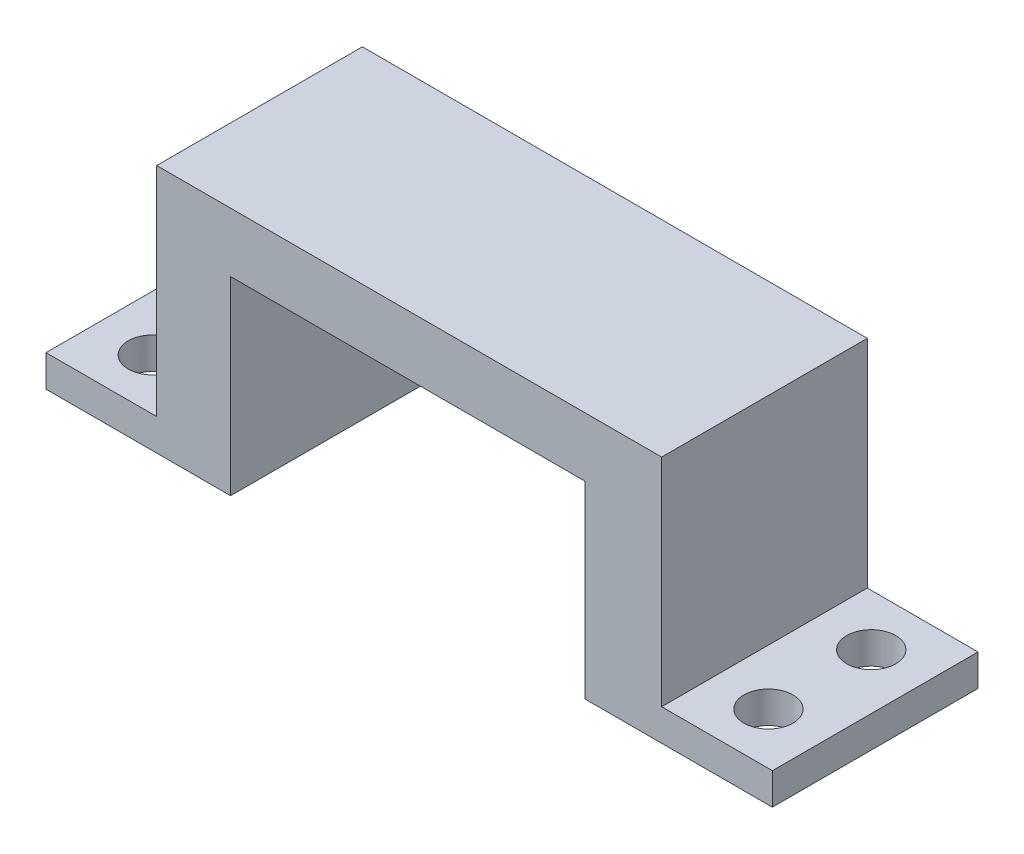
ISO-10303-21;
HEADER;
FILE_DESCRIPTION(('STEP AP214'),'2;1');
FILE_NAME('part.step','',(''),(''),'','','');
FILE_SCHEMA(('AUTOMOTIVE_DESIGN { 1 0 10303 214 1 1 1 1 }'));
ENDSEC;
DATA;
#1=APPLICATION_CONTEXT('core data for automotive mechanical design processes');
#2=APPLICATION_PROTOCOL_DEFINITION('international standard','automotive_design',2000,#1);
#3=PRODUCT_CONTEXT('',#1,'mechanical');
#4=PRODUCT('Part','Part','',(#3));
#5=PRODUCT_RELATED_PRODUCT_CATEGORY('part','',(#4));
#6=PRODUCT_DEFINITION_FORMATION('','',#4);
#7=PRODUCT_DEFINITION_CONTEXT('part definition',#1,'design');
#8=PRODUCT_DEFINITION('design','',#6,#7);
#9=PRODUCT_DEFINITION_SHAPE('','',#8);
#10=(LENGTH_UNIT() NAMED_UNIT(*) SI_UNIT(.MILLI.,.METRE.));
#11=(NAMED_UNIT(*) PLANE_ANGLE_UNIT() SI_UNIT($,.RADIAN.));
#12=(NAMED_UNIT(*) SI_UNIT($,.STERADIAN.) SOLID_ANGLE_UNIT());
#13=UNCERTAINTY_MEASURE_WITH_UNIT(LENGTH_MEASURE(1.E-05),#10,'distance_accuracy_value','');
#14=(GEOMETRIC_REPRESENTATION_CONTEXT(3) GLOBAL_UNCERTAINTY_ASSIGNED_CONTEXT((#13)) GLOBAL_UNIT_ASSIGNED_CONTEXT((#10,
#11,#12)) REPRESENTATION_CONTEXT('',''));
#15=CARTESIAN_POINT('',(0.,0.,0.));
#16=DIRECTION('',(0.,0.,1.));
#17=DIRECTION('',(1.,0.,0.));
#18=AXIS2_PLACEMENT_3D('',#15,#16,#17);
#19=CARTESIAN_POINT('',(0.,4.99999999999997,13.));
#20=DIRECTION('',(0.,1.,0.));
#21=DIRECTION('',(-1.,0.,0.));
#22=AXIS2_PLACEMENT_3D('',#19,#20,#21);
#23=PLANE('',#22);
#24=CARTESIAN_POINT('',(-52.5285351509152,5.,9.75));
#25=DIRECTION('',(0.,1.,0.));
#26=DIRECTION('',(0.,0.,-1.));
#27=AXIS2_PLACEMENT_3D('',#24,#25,#26);
#28=CIRCLE('',#27,1.55);
#29=CARTESIAN_POINT('',(-52.5285351509152,5.,8.2));
#30=VERTEX_POINT('',#29);
#31=EDGE_CURVE('E228',#30,#30,#28,.T.);
#32=ORIENTED_EDGE('',*,*,#31,.T.);
#33=EDGE_LOOP('',(#32));
#34=FACE_BOUND('',#33,.T.);
#35=CARTESIAN_POINT('',(-52.5285351509152,5.,3.25));
#36=DIRECTION('',(0.,1.,0.));
#37=DIRECTION('',(0.,0.,1.));
#38=AXIS2_PLACEMENT_3D('',#35,#36,#37);
#39=CIRCLE('',#38,1.54999999999999);
#40=CARTESIAN_POINT('',(-52.5285351509152,5.,4.8));
#41=VERTEX_POINT('',#40);
#42=EDGE_CURVE('E214',#41,#41,#39,.T.);
#43=ORIENTED_EDGE('',*,*,#42,.T.);
#44=EDGE_LOOP('',(#43));
#45=FACE_BOUND('',#44,.T.);
#46=DIRECTION('',(1.,0.,0.));
#47=VECTOR('',#46,1.);
#48=CARTESIAN_POINT('',(0.,4.99999999999997,0.));
#49=LINE('',#48,#47);
#50=CARTESIAN_POINT('',(-56.0285351509152,5.,0.));
#51=VERTEX_POINT('',#50);
#52=CARTESIAN_POINT('',(-44.3575351509152,5.,0.));
#53=VERTEX_POINT('',#52);
#54=EDGE_CURVE('E160',#51,#53,#49,.T.);
#55=ORIENTED_EDGE('',*,*,#54,.T.);
#56=DIRECTION('',(0.,0.,-1.));
#57=VECTOR('',#56,1.);
#58=CARTESIAN_POINT('',(-44.3575351509152,5.,13.));
#59=LINE('',#58,#57);
#60=CARTESIAN_POINT('',(-44.3575351509152,5.,13.));
#61=VERTEX_POINT('',#60);
#62=EDGE_CURVE('E11',#61,#53,#59,.T.);
#63=ORIENTED_EDGE('',*,*,#62,.F.);
#64=DIRECTION('',(1.,0.,0.));
#65=VECTOR('',#64,1.);
#66=CARTESIAN_POINT('',(0.,4.99999999999997,13.));
#67=LINE('',#66,#65);
#68=CARTESIAN_POINT('',(-56.0285351509152,5.,13.));
#69=VERTEX_POINT('',#68);
#70=EDGE_CURVE('E189',#69,#61,#67,.T.);
#71=ORIENTED_EDGE('',*,*,#70,.F.);
#72=DIRECTION('',(0.,0.,-1.));
#73=VECTOR('',#72,1.);
#74=CARTESIAN_POINT('',(-56.0285351509152,5.,13.));
#75=LINE('',#74,#73);
#76=EDGE_CURVE('E53',#69,#51,#75,.T.);
#77=ORIENTED_EDGE('',*,*,#76,.T.);
#78=EDGE_LOOP('',(#55,#63,#71,#77));
#79=FACE_BOUND('',#78,.T.);
#80=ADVANCED_FACE('F35',(#34,#45,#79),#23,.F.);
#81=CARTESIAN_POINT('',(-44.3575351509152,0.,13.));
#82=DIRECTION('',(-1.,0.,0.));
#83=DIRECTION('',(0.,0.,1.));
#84=AXIS2_PLACEMENT_3D('',#81,#82,#83);
#85=PLANE('',#84);
#86=DIRECTION('',(0.,1.,0.));
#87=VECTOR('',#86,1.);
#88=CARTESIAN_POINT('',(-44.3575351509152,0.,0.));
#89=LINE('',#88,#87);
#90=CARTESIAN_POINT('',(-44.3575351509152,17.,0.));
#91=VERTEX_POINT('',#90);
#92=EDGE_CURVE('E162',#53,#91,#89,.T.);
#93=ORIENTED_EDGE('',*,*,#92,.T.);
#94=DIRECTION('',(0.,0.,-1.));
#95=VECTOR('',#94,1.);
#96=CARTESIAN_POINT('',(-44.3575351509152,17.,13.));
#97=LINE('',#96,#95);
#98=CARTESIAN_POINT('',(-44.3575351509152,17.,13.));
#99=VERTEX_POINT('',#98);
#100=EDGE_CURVE('E44',#99,#91,#97,.T.);
#101=ORIENTED_EDGE('',*,*,#100,.F.);
#102=DIRECTION('',(0.,1.,0.));
#103=VECTOR('',#102,1.);
#104=CARTESIAN_POINT('',(-44.3575351509152,0.,13.));
#105=LINE('',#104,#103);
#106=EDGE_CURVE('E104',#61,#99,#105,.T.);
#107=ORIENTED_EDGE('',*,*,#106,.F.);
#108=ORIENTED_EDGE('',*,*,#62,.T.);
#109=EDGE_LOOP('',(#93,#101,#107,#108));
#110=FACE_BOUND('',#109,.T.);
#111=ADVANCED_FACE('F267',(#110),#85,.F.);
#112=CARTESIAN_POINT('',(0.,17.,13.));
#113=DIRECTION('',(0.,1.,0.));
#114=DIRECTION('',(0.,0.,1.));
#115=AXIS2_PLACEMENT_3D('',#112,#113,#114);
#116=PLANE('',#115);
#117=DIRECTION('',(1.,0.,0.));
#118=VECTOR('',#117,1.);
#119=CARTESIAN_POINT('',(0.,17.,0.));
#120=LINE('',#119,#118);
#121=CARTESIAN_POINT('',(-21.9575351509152,17.,0.));
#122=VERTEX_POINT('',#121);
#123=EDGE_CURVE('E165',#91,#122,#120,.T.);
#124=ORIENTED_EDGE('',*,*,#123,.T.);
#125=DIRECTION('',(0.,0.,-1.));
#126=VECTOR('',#125,1.);
#127=CARTESIAN_POINT('',(-21.9575351509152,17.,13.));
#128=LINE('',#127,#126);
#129=CARTESIAN_POINT('',(-21.9575351509152,17.,13.));
#130=VERTEX_POINT('',#129);
#131=EDGE_CURVE('E205',#130,#122,#128,.T.);
#132=ORIENTED_EDGE('',*,*,#131,.F.);
#133=DIRECTION('',(1.,0.,0.));
#134=VECTOR('',#133,1.);
#135=CARTESIAN_POINT('',(0.,17.,13.));
#136=LINE('',#135,#134);
#137=EDGE_CURVE('E234',#99,#130,#136,.T.);
#138=ORIENTED_EDGE('',*,*,#137,.F.);
#139=ORIENTED_EDGE('',*,*,#100,.T.);
#140=EDGE_LOOP('',(#124,#132,#138,#139));
#141=FACE_BOUND('',#140,.T.);
#142=ADVANCED_FACE('F272',(#141),#116,.F.);
#143=CARTESIAN_POINT('',(-21.9575351509152,0.,13.));
#144=DIRECTION('',(1.,0.,0.));
#145=DIRECTION('',(0.,0.,-1.));
#146=AXIS2_PLACEMENT_3D('',#143,#144,#145);
#147=PLANE('',#146);
#148=DIRECTION('',(0.,-1.,0.));
#149=VECTOR('',#148,1.);
#150=CARTESIAN_POINT('',(-21.9575351509152,0.,0.));
#151=LINE('',#150,#149);
#152=CARTESIAN_POINT('',(-21.9575351509152,5.07439487757862,0.));
#153=VERTEX_POINT('',#152);
#154=EDGE_CURVE('E167',#122,#153,#151,.T.);
#155=ORIENTED_EDGE('',*,*,#154,.T.);
#156=DIRECTION('',(0.,0.,-1.));
#157=VECTOR('',#156,1.);
#158=CARTESIAN_POINT('',(-21.9575351509152,5.07439487757862,13.));
#159=LINE('',#158,#157);
#160=CARTESIAN_POINT('',(-21.9575351509152,5.07439487757862,13.));
#161=VERTEX_POINT('',#160);
#162=EDGE_CURVE('E202',#161,#153,#159,.T.);
#163=ORIENTED_EDGE('',*,*,#162,.F.);
#164=DIRECTION('',(0.,-1.,0.));
#165=VECTOR('',#164,1.);
#166=CARTESIAN_POINT('',(-21.9575351509152,0.,13.));
#167=LINE('',#166,#165);
#168=EDGE_CURVE('E236',#130,#161,#167,.T.);
#169=ORIENTED_EDGE('',*,*,#168,.F.);
#170=ORIENTED_EDGE('',*,*,#131,.T.);
#171=EDGE_LOOP('',(#155,#163,#169,#170));
#172=FACE_BOUND('',#171,.T.);
#173=ADVANCED_FACE('F288',(#172),#147,.F.);
#174=CARTESIAN_POINT('',(0.,5.07439487757862,13.));
#175=DIRECTION('',(0.,1.,0.));
#176=DIRECTION('',(0.,0.,1.));
#177=AXIS2_PLACEMENT_3D('',#174,#175,#176);
#178=PLANE('',#177);
#179=CARTESIAN_POINT('',(-13.6069300284939,5.07439487757862,3.25));
#180=DIRECTION('',(0.,1.,0.));
#181=DIRECTION('',(0.,0.,1.));
#182=AXIS2_PLACEMENT_3D('',#179,#180,#181);
#183=CIRCLE('',#182,1.55);
#184=CARTESIAN_POINT('',(-13.6069300284939,5.07439487757862,4.8));
#185=VERTEX_POINT('',#184);
#186=EDGE_CURVE('E163',#185,#185,#183,.T.);
#187=ORIENTED_EDGE('',*,*,#186,.T.);
#188=EDGE_LOOP('',(#187));
#189=FACE_BOUND('',#188,.T.);
#190=CARTESIAN_POINT('',(-13.6069300284939,5.07439487757862,9.75));
#191=DIRECTION('',(0.,1.,0.));
#192=DIRECTION('',(0.,0.,1.));
#193=AXIS2_PLACEMENT_3D('',#190,#191,#192);
#194=CIRCLE('',#193,1.55);
#195=CARTESIAN_POINT('',(-13.6069300284939,5.07439487757862,11.3));
#196=VERTEX_POINT('',#195);
#197=EDGE_CURVE('E218',#196,#196,#194,.T.);
#198=ORIENTED_EDGE('',*,*,#197,.T.);
#199=EDGE_LOOP('',(#198));
#200=FACE_BOUND('',#199,.T.);
#201=DIRECTION('',(1.,0.,0.));
#202=VECTOR('',#201,1.);
#203=CARTESIAN_POINT('',(0.,5.07439487757862,0.));
#204=LINE('',#203,#202);
#205=CARTESIAN_POINT('',(-10.1069300284939,5.07439487757862,0.));
#206=VERTEX_POINT('',#205);
#207=EDGE_CURVE('E169',#153,#206,#204,.T.);
#208=ORIENTED_EDGE('',*,*,#207,.T.);
#209=DIRECTION('',(0.,0.,-1.));
#210=VECTOR('',#209,1.);
#211=CARTESIAN_POINT('',(-10.1069300284939,5.07439487757862,13.));
#212=LINE('',#211,#210);
#213=CARTESIAN_POINT('',(-10.1069300284939,5.07439487757862,13.));
#214=VERTEX_POINT('',#213);
#215=EDGE_CURVE('E199',#214,#206,#212,.T.);
#216=ORIENTED_EDGE('',*,*,#215,.F.);
#217=DIRECTION('',(1.,0.,0.));
#218=VECTOR('',#217,1.);
#219=CARTESIAN_POINT('',(0.,5.07439487757862,13.));
#220=LINE('',#219,#218);
#221=EDGE_CURVE('E238',#161,#214,#220,.T.);
#222=ORIENTED_EDGE('',*,*,#221,.F.);
#223=ORIENTED_EDGE('',*,*,#162,.T.);
#224=EDGE_LOOP('',(#208,#216,#222,#223));
#225=FACE_BOUND('',#224,.T.);
#226=ADVANCED_FACE('F292',(#189,#200,#225),#178,.F.);
#227=CARTESIAN_POINT('',(-10.1069300284939,0.,13.));
#228=DIRECTION('',(-1.,0.,0.));
#229=DIRECTION('',(0.,0.,1.));
#230=AXIS2_PLACEMENT_3D('',#227,#228,#229);
#231=PLANE('',#230);
#232=DIRECTION('',(0.,1.,0.));
#233=VECTOR('',#232,1.);
#234=CARTESIAN_POINT('',(-10.1069300284939,0.,0.));
#235=LINE('',#234,#233);
#236=CARTESIAN_POINT('',(-10.1069300284939,7.07439487757862,0.));
#237=VERTEX_POINT('',#236);
#238=EDGE_CURVE('E171',#206,#237,#235,.T.);
#239=ORIENTED_EDGE('',*,*,#238,.T.);
#240=DIRECTION('',(0.,0.,-1.));
#241=VECTOR('',#240,1.);
#242=CARTESIAN_POINT('',(-10.1069300284939,7.07439487757862,13.));
#243=LINE('',#242,#241);
#244=CARTESIAN_POINT('',(-10.1069300284939,7.07439487757862,13.));
#245=VERTEX_POINT('',#244);
#246=EDGE_CURVE('E197',#245,#237,#243,.T.);
#247=ORIENTED_EDGE('',*,*,#246,.F.);
#248=DIRECTION('',(0.,1.,0.));
#249=VECTOR('',#248,1.);
#250=CARTESIAN_POINT('',(-10.1069300284939,0.,13.));
#251=LINE('',#250,#249);
#252=EDGE_CURVE('E240',#214,#245,#251,.T.);
#253=ORIENTED_EDGE('',*,*,#252,.F.);
#254=ORIENTED_EDGE('',*,*,#215,.T.);
#255=EDGE_LOOP('',(#239,#247,#253,#254));
#256=FACE_BOUND('',#255,.T.);
#257=ADVANCED_FACE('F297',(#256),#231,.F.);
#258=CARTESIAN_POINT('',(0.,7.07439487757862,13.));
#259=DIRECTION('',(0.,1.,0.));
#260=DIRECTION('',(0.,0.,1.));
#261=AXIS2_PLACEMENT_3D('',#258,#259,#260);
#262=PLANE('',#261);
#263=CARTESIAN_POINT('',(-13.6069300284939,7.07439487757862,3.25));
#264=DIRECTION('',(0.,1.,0.));
#265=DIRECTION('',(0.,0.,1.));
#266=AXIS2_PLACEMENT_3D('',#263,#264,#265);
#267=CIRCLE('',#266,1.55);
#268=CARTESIAN_POINT('',(-13.6069300284939,7.07439487757862,4.8));
#269=VERTEX_POINT('',#268);
#270=EDGE_CURVE('E38',#269,#269,#267,.T.);
#271=ORIENTED_EDGE('',*,*,#270,.F.);
#272=EDGE_LOOP('',(#271));
#273=FACE_BOUND('',#272,.T.);
#274=CARTESIAN_POINT('',(-13.6069300284939,7.07439487757862,9.75));
#275=DIRECTION('',(0.,1.,0.));
#276=DIRECTION('',(0.,0.,1.));
#277=AXIS2_PLACEMENT_3D('',#274,#275,#276);
#278=CIRCLE('',#277,1.55);
#279=CARTESIAN_POINT('',(-13.6069300284939,7.07439487757862,11.3));
#280=VERTEX_POINT('',#279);
#281=EDGE_CURVE('E216',#280,#280,#278,.T.);
#282=ORIENTED_EDGE('',*,*,#281,.F.);
#283=EDGE_LOOP('',(#282));
#284=FACE_BOUND('',#283,.T.);
#285=DIRECTION('',(1.,0.,0.));
#286=VECTOR('',#285,1.);
#287=CARTESIAN_POINT('',(0.,7.07439487757862,0.));
#288=LINE('',#287,#286);
#289=CARTESIAN_POINT('',(-17.1069300284939,7.07439487757862,0.));
#290=VERTEX_POINT('',#289);
#291=EDGE_CURVE('E174',#290,#237,#288,.T.);
#292=ORIENTED_EDGE('',*,*,#291,.F.);
#293=DIRECTION('',(0.,0.,-1.));
#294=VECTOR('',#293,1.);
#295=CARTESIAN_POINT('',(-17.1069300284939,7.07439487757862,13.));
#296=LINE('',#295,#294);
#297=CARTESIAN_POINT('',(-17.1069300284939,7.07439487757862,13.));
#298=VERTEX_POINT('',#297);
#299=EDGE_CURVE('E195',#298,#290,#296,.T.);
#300=ORIENTED_EDGE('',*,*,#299,.F.);
#301=DIRECTION('',(1.,0.,0.));
#302=VECTOR('',#301,1.);
#303=CARTESIAN_POINT('',(0.,7.07439487757862,13.));
#304=LINE('',#303,#302);
#305=EDGE_CURVE('E242',#298,#245,#304,.T.);
#306=ORIENTED_EDGE('',*,*,#305,.T.);
#307=ORIENTED_EDGE('',*,*,#246,.T.);
#308=EDGE_LOOP('',(#292,#300,#306,#307));
#309=FACE_BOUND('',#308,.T.);
#310=ADVANCED_FACE('F299',(#273,#284,#309),#262,.T.);
#311=CARTESIAN_POINT('',(-17.1069300284939,0.,13.));
#312=DIRECTION('',(1.,0.,0.));
#313=DIRECTION('',(0.,0.,-1.));
#314=AXIS2_PLACEMENT_3D('',#311,#312,#313);
#315=PLANE('',#314);
#316=DIRECTION('',(0.,-1.,0.));
#317=VECTOR('',#316,1.);
#318=CARTESIAN_POINT('',(-17.1069300284939,0.,0.));
#319=LINE('',#318,#317);
#320=CARTESIAN_POINT('',(-17.1069300284939,20.746,0.));
#321=VERTEX_POINT('',#320);
#322=EDGE_CURVE('E177',#321,#290,#319,.T.);
#323=ORIENTED_EDGE('',*,*,#322,.F.);
#324=DIRECTION('',(0.,0.,-1.));
#325=VECTOR('',#324,1.);
#326=CARTESIAN_POINT('',(-17.1069300284939,20.746,13.));
#327=LINE('',#326,#325);
#328=CARTESIAN_POINT('',(-17.1069300284939,20.746,13.));
#329=VERTEX_POINT('',#328);
#330=EDGE_CURVE('E193',#329,#321,#327,.T.);
#331=ORIENTED_EDGE('',*,*,#330,.F.);
#332=DIRECTION('',(0.,-1.,0.));
#333=VECTOR('',#332,1.);
#334=CARTESIAN_POINT('',(-17.1069300284939,0.,13.));
#335=LINE('',#334,#333);
#336=EDGE_CURVE('E155',#329,#298,#335,.T.);
#337=ORIENTED_EDGE('',*,*,#336,.T.);
#338=ORIENTED_EDGE('',*,*,#299,.T.);
#339=EDGE_LOOP('',(#323,#331,#337,#338));
#340=FACE_BOUND('',#339,.T.);
#341=ADVANCED_FACE('F247',(#340),#315,.T.);
#342=CARTESIAN_POINT('',(0.,20.746,13.));
#343=DIRECTION('',(0.,1.,0.));
#344=DIRECTION('',(0.,0.,1.));
#345=AXIS2_PLACEMENT_3D('',#342,#343,#344);
#346=PLANE('',#345);
#347=DIRECTION('',(1.,0.,0.));
#348=VECTOR('',#347,1.);
#349=CARTESIAN_POINT('',(0.,20.746,0.));
#350=LINE('',#349,#348);
#351=CARTESIAN_POINT('',(-49.0285351509152,20.746,0.));
#352=VERTEX_POINT('',#351);
#353=EDGE_CURVE('E180',#352,#321,#350,.T.);
#354=ORIENTED_EDGE('',*,*,#353,.F.);
#355=DIRECTION('',(0.,0.,-1.));
#356=VECTOR('',#355,1.);
#357=CARTESIAN_POINT('',(-49.0285351509152,20.746,13.));
#358=LINE('',#357,#356);
#359=CARTESIAN_POINT('',(-49.0285351509152,20.746,13.));
#360=VERTEX_POINT('',#359);
#361=EDGE_CURVE('E141',#360,#352,#358,.T.);
#362=ORIENTED_EDGE('',*,*,#361,.F.);
#363=DIRECTION('',(1.,0.,0.));
#364=VECTOR('',#363,1.);
#365=CARTESIAN_POINT('',(0.,20.746,13.));
#366=LINE('',#365,#364);
#367=EDGE_CURVE('E153',#360,#329,#366,.T.);
#368=ORIENTED_EDGE('',*,*,#367,.T.);
#369=ORIENTED_EDGE('',*,*,#330,.T.);
#370=EDGE_LOOP('',(#354,#362,#368,#369));
#371=FACE_BOUND('',#370,.T.);
#372=ADVANCED_FACE('F252',(#371),#346,.T.);
#373=CARTESIAN_POINT('',(-49.0285351509152,0.,13.));
#374=DIRECTION('',(-1.,0.,0.));
#375=DIRECTION('',(0.,0.,1.));
#376=AXIS2_PLACEMENT_3D('',#373,#374,#375);
#377=PLANE('',#376);
#378=DIRECTION('',(0.,1.,0.));
#379=VECTOR('',#378,1.);
#380=CARTESIAN_POINT('',(-49.0285351509152,0.,0.));
#381=LINE('',#380,#379);
#382=CARTESIAN_POINT('',(-49.0285351509152,7.,0.));
#383=VERTEX_POINT('',#382);
#384=EDGE_CURVE('E138',#383,#352,#381,.T.);
#385=ORIENTED_EDGE('',*,*,#384,.F.);
#386=DIRECTION('',(0.,0.,-1.));
#387=VECTOR('',#386,1.);
#388=CARTESIAN_POINT('',(-49.0285351509152,7.,13.));
#389=LINE('',#388,#387);
#390=CARTESIAN_POINT('',(-49.0285351509152,7.,13.));
#391=VERTEX_POINT('',#390);
#392=EDGE_CURVE('E132',#391,#383,#389,.T.);
#393=ORIENTED_EDGE('',*,*,#392,.F.);
#394=DIRECTION('',(0.,1.,0.));
#395=VECTOR('',#394,1.);
#396=CARTESIAN_POINT('',(-49.0285351509152,0.,13.));
#397=LINE('',#396,#395);
#398=EDGE_CURVE('E136',#391,#360,#397,.T.);
#399=ORIENTED_EDGE('',*,*,#398,.T.);
#400=ORIENTED_EDGE('',*,*,#361,.T.);
#401=EDGE_LOOP('',(#385,#393,#399,#400));
#402=FACE_BOUND('',#401,.T.);
#403=ADVANCED_FACE('F134',(#402),#377,.T.);
#404=CARTESIAN_POINT('',(0.,7.00000000000001,13.));
#405=DIRECTION('',(0.,-1.,0.));
#406=DIRECTION('',(1.,0.,0.));
#407=AXIS2_PLACEMENT_3D('',#404,#405,#406);
#408=PLANE('',#407);
#409=CARTESIAN_POINT('',(-52.5285351509152,7.,9.75));
#410=DIRECTION('',(0.,-1.,0.));
#411=DIRECTION('',(1.,0.,0.));
#412=AXIS2_PLACEMENT_3D('',#409,#410,#411);
#413=CIRCLE('',#412,1.55);
#414=CARTESIAN_POINT('',(-50.9785351509152,7.,9.75));
#415=VERTEX_POINT('',#414);
#416=EDGE_CURVE('E213',#415,#415,#413,.T.);
#417=ORIENTED_EDGE('',*,*,#416,.T.);
#418=EDGE_LOOP('',(#417));
#419=FACE_BOUND('',#418,.T.);
#420=CARTESIAN_POINT('',(-52.5285351509152,7.,3.25));
#421=DIRECTION('',(0.,-1.,0.));
#422=DIRECTION('',(1.,0.,0.));
#423=AXIS2_PLACEMENT_3D('',#420,#421,#422);
#424=CIRCLE('',#423,1.54999999999999);
#425=CARTESIAN_POINT('',(-50.9785351509152,7.,3.25));
#426=VERTEX_POINT('',#425);
#427=EDGE_CURVE('E210',#426,#426,#424,.T.);
#428=ORIENTED_EDGE('',*,*,#427,.T.);
#429=EDGE_LOOP('',(#428));
#430=FACE_BOUND('',#429,.T.);
#431=DIRECTION('',(-1.,0.,0.));
#432=VECTOR('',#431,1.);
#433=CARTESIAN_POINT('',(0.,7.00000000000001,0.));
#434=LINE('',#433,#432);
#435=CARTESIAN_POINT('',(-56.0285351509152,7.,0.));
#436=VERTEX_POINT('',#435);
#437=EDGE_CURVE('E184',#383,#436,#434,.T.);
#438=ORIENTED_EDGE('',*,*,#437,.T.);
#439=DIRECTION('',(0.,0.,-1.));
#440=VECTOR('',#439,1.);
#441=CARTESIAN_POINT('',(-56.0285351509152,7.,13.));
#442=LINE('',#441,#440);
#443=CARTESIAN_POINT('',(-56.0285351509152,7.,13.));
#444=VERTEX_POINT('',#443);
#445=EDGE_CURVE('E92',#444,#436,#442,.T.);
#446=ORIENTED_EDGE('',*,*,#445,.F.);
#447=DIRECTION('',(-1.,0.,0.));
#448=VECTOR('',#447,1.);
#449=CARTESIAN_POINT('',(0.,7.00000000000001,13.));
#450=LINE('',#449,#448);
#451=EDGE_CURVE('E143',#391,#444,#450,.T.);
#452=ORIENTED_EDGE('',*,*,#451,.F.);
#453=ORIENTED_EDGE('',*,*,#392,.T.);
#454=EDGE_LOOP('',(#438,#446,#452,#453));
#455=FACE_BOUND('',#454,.T.);
#456=ADVANCED_FACE('F144',(#419,#430,#455),#408,.F.);
#457=CARTESIAN_POINT('',(-56.0285351509152,0.,13.));
#458=DIRECTION('',(-1.,0.,0.));
#459=DIRECTION('',(0.,0.,1.));
#460=AXIS2_PLACEMENT_3D('',#457,#458,#459);
#461=PLANE('',#460);
#462=DIRECTION('',(0.,1.,0.));
#463=VECTOR('',#462,1.);
#464=CARTESIAN_POINT('',(-56.0285351509152,0.,0.));
#465=LINE('',#464,#463);
#466=EDGE_CURVE('E186',#51,#436,#465,.T.);
#467=ORIENTED_EDGE('',*,*,#466,.F.);
#468=ORIENTED_EDGE('',*,*,#76,.F.);
#469=DIRECTION('',(0.,1.,0.));
#470=VECTOR('',#469,1.);
#471=CARTESIAN_POINT('',(-56.0285351509152,0.,13.));
#472=LINE('',#471,#470);
#473=EDGE_CURVE('E147',#69,#444,#472,.T.);
#474=ORIENTED_EDGE('',*,*,#473,.T.);
#475=ORIENTED_EDGE('',*,*,#445,.T.);
#476=EDGE_LOOP('',(#467,#468,#474,#475));
#477=FACE_BOUND('',#476,.T.);
#478=ADVANCED_FACE('F255',(#477),#461,.T.);
#479=CARTESIAN_POINT('',(0.,0.,13.));
#480=DIRECTION('',(0.,0.,1.));
#481=DIRECTION('',(1.,0.,0.));
#482=AXIS2_PLACEMENT_3D('',#479,#480,#481);
#483=PLANE('',#482);
#484=ORIENTED_EDGE('',*,*,#70,.T.);
#485=ORIENTED_EDGE('',*,*,#106,.T.);
#486=ORIENTED_EDGE('',*,*,#137,.T.);
#487=ORIENTED_EDGE('',*,*,#168,.T.);
#488=ORIENTED_EDGE('',*,*,#221,.T.);
#489=ORIENTED_EDGE('',*,*,#252,.T.);
#490=ORIENTED_EDGE('',*,*,#305,.F.);
#491=ORIENTED_EDGE('',*,*,#336,.F.);
#492=ORIENTED_EDGE('',*,*,#367,.F.);
#493=ORIENTED_EDGE('',*,*,#398,.F.);
#494=ORIENTED_EDGE('',*,*,#451,.T.);
#495=ORIENTED_EDGE('',*,*,#473,.F.);
#496=EDGE_LOOP('',(#484,#485,#486,#487,#488,#489,#490,#491,#492,#493,#494,#495));
#497=FACE_BOUND('',#496,.T.);
#498=ADVANCED_FACE('F150',(#497),#483,.T.);
#499=CARTESIAN_POINT('',(0.,0.,0.));
#500=DIRECTION('',(0.,0.,1.));
#501=DIRECTION('',(1.,0.,0.));
#502=AXIS2_PLACEMENT_3D('',#499,#500,#501);
#503=PLANE('',#502);
#504=ORIENTED_EDGE('',*,*,#54,.F.);
#505=ORIENTED_EDGE('',*,*,#466,.T.);
#506=ORIENTED_EDGE('',*,*,#437,.F.);
#507=ORIENTED_EDGE('',*,*,#384,.T.);
#508=ORIENTED_EDGE('',*,*,#353,.T.);
#509=ORIENTED_EDGE('',*,*,#322,.T.);
#510=ORIENTED_EDGE('',*,*,#291,.T.);
#511=ORIENTED_EDGE('',*,*,#238,.F.);
#512=ORIENTED_EDGE('',*,*,#207,.F.);
#513=ORIENTED_EDGE('',*,*,#154,.F.);
#514=ORIENTED_EDGE('',*,*,#123,.F.);
#515=ORIENTED_EDGE('',*,*,#92,.F.);
#516=EDGE_LOOP('',(#504,#505,#506,#507,#508,#509,#510,#511,#512,#513,#514,#515));
#517=FACE_BOUND('',#516,.T.);
#518=ADVANCED_FACE('F254',(#517),#503,.F.);
#519=CARTESIAN_POINT('',(-52.5285351509152,5.,3.25));
#520=DIRECTION('',(0.,1.,0.));
#521=DIRECTION('',(0.,0.,1.));
#522=AXIS2_PLACEMENT_3D('',#519,#520,#521);
#523=CYLINDRICAL_SURFACE('',#522,1.54999999999999);
#524=ORIENTED_EDGE('',*,*,#42,.F.);
#525=EDGE_LOOP('',(#524));
#526=FACE_BOUND('',#525,.T.);
#527=ORIENTED_EDGE('',*,*,#427,.F.);
#528=EDGE_LOOP('',(#527));
#529=FACE_BOUND('',#528,.T.);
#530=ADVANCED_FACE('F383',(#526,#529),#523,.F.);
#531=CARTESIAN_POINT('',(-52.5285351509152,5.,9.75));
#532=DIRECTION('',(0.,1.,0.));
#533=DIRECTION('',(0.,0.,1.));
#534=AXIS2_PLACEMENT_3D('',#531,#532,#533);
#535=CYLINDRICAL_SURFACE('',#534,1.55);
#536=ORIENTED_EDGE('',*,*,#31,.F.);
#537=EDGE_LOOP('',(#536));
#538=FACE_BOUND('',#537,.T.);
#539=ORIENTED_EDGE('',*,*,#416,.F.);
#540=EDGE_LOOP('',(#539));
#541=FACE_BOUND('',#540,.T.);
#542=ADVANCED_FACE('F419',(#538,#541),#535,.F.);
#543=CARTESIAN_POINT('',(-13.6069300284939,5.,9.75));
#544=DIRECTION('',(0.,1.,0.));
#545=DIRECTION('',(0.,0.,1.));
#546=AXIS2_PLACEMENT_3D('',#543,#544,#545);
#547=CYLINDRICAL_SURFACE('',#546,1.55);
#548=ORIENTED_EDGE('',*,*,#281,.T.);
#549=EDGE_LOOP('',(#548));
#550=FACE_BOUND('',#549,.T.);
#551=ORIENTED_EDGE('',*,*,#197,.F.);
#552=EDGE_LOOP('',(#551));
#553=FACE_BOUND('',#552,.T.);
#554=ADVANCED_FACE('F427',(#550,#553),#547,.F.);
#555=CARTESIAN_POINT('',(-13.6069300284939,5.,3.25));
#556=DIRECTION('',(0.,1.,0.));
#557=DIRECTION('',(0.,0.,1.));
#558=AXIS2_PLACEMENT_3D('',#555,#556,#557);
#559=CYLINDRICAL_SURFACE('',#558,1.55);
#560=ORIENTED_EDGE('',*,*,#270,.T.);
#561=EDGE_LOOP('',(#560));
#562=FACE_BOUND('',#561,.T.);
#563=ORIENTED_EDGE('',*,*,#186,.F.);
#564=EDGE_LOOP('',(#563));
#565=FACE_BOUND('',#564,.T.);
#566=ADVANCED_FACE('F435',(#562,#565),#559,.F.);
#567=CLOSED_SHELL('',(#80,#111,#142,#173,#226,#257,#310,#341,#372,#403,#456,#478,#498,#518,#530,
#542,#554,#566));
#568=MANIFOLD_SOLID_BREP('B2',#567);
#569=ADVANCED_BREP_SHAPE_REPRESENTATION('',(#18,#568),#14);
#570=SHAPE_DEFINITION_REPRESENTATION(#9,#569);
ENDSEC;
END-ISO-10303-21;
